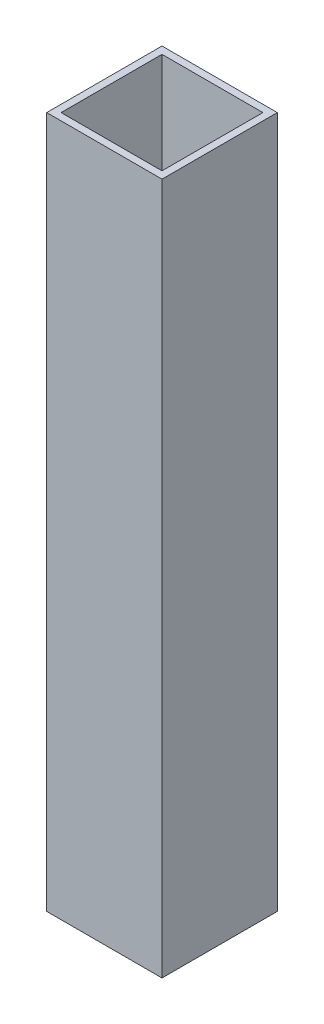
ISO-10303-21;
HEADER;
FILE_DESCRIPTION(('STEP AP214'),'2;1');
FILE_NAME('part.step','',(''),(''),'','','');
FILE_SCHEMA(('AUTOMOTIVE_DESIGN { 1 0 10303 214 1 1 1 1 }'));
ENDSEC;
DATA;
#1=APPLICATION_CONTEXT('core data for automotive mechanical design processes');
#2=APPLICATION_PROTOCOL_DEFINITION('international standard','automotive_design',2000,#1);
#3=PRODUCT_CONTEXT('',#1,'mechanical');
#4=PRODUCT('Part','Part','',(#3));
#5=PRODUCT_RELATED_PRODUCT_CATEGORY('part','',(#4));
#6=PRODUCT_DEFINITION_FORMATION('','',#4);
#7=PRODUCT_DEFINITION_CONTEXT('part definition',#1,'design');
#8=PRODUCT_DEFINITION('design','',#6,#7);
#9=PRODUCT_DEFINITION_SHAPE('','',#8);
#10=(LENGTH_UNIT() NAMED_UNIT(*) SI_UNIT(.MILLI.,.METRE.));
#11=(NAMED_UNIT(*) PLANE_ANGLE_UNIT() SI_UNIT($,.RADIAN.));
#12=(NAMED_UNIT(*) SI_UNIT($,.STERADIAN.) SOLID_ANGLE_UNIT());
#13=UNCERTAINTY_MEASURE_WITH_UNIT(LENGTH_MEASURE(1.E-05),#10,'distance_accuracy_value','');
#14=(GEOMETRIC_REPRESENTATION_CONTEXT(3) GLOBAL_UNCERTAINTY_ASSIGNED_CONTEXT((#13)) GLOBAL_UNIT_ASSIGNED_CONTEXT((#10,
#11,#12)) REPRESENTATION_CONTEXT('',''));
#15=CARTESIAN_POINT('',(0.,0.,0.));
#16=DIRECTION('',(0.,0.,1.));
#17=DIRECTION('',(1.,0.,0.));
#18=AXIS2_PLACEMENT_3D('',#15,#16,#17);
#19=CARTESIAN_POINT('',(0.,152.4,0.));
#20=DIRECTION('',(0.,1.,0.));
#21=DIRECTION('',(0.,0.,1.));
#22=AXIS2_PLACEMENT_3D('',#19,#20,#21);
#23=PLANE('',#22);
#24=DIRECTION('',(0.,0.,1.));
#25=VECTOR('',#24,1.);
#26=CARTESIAN_POINT('',(-12.7,152.4,12.7));
#27=LINE('',#26,#25);
#28=CARTESIAN_POINT('',(-12.7,152.4,-12.7));
#29=VERTEX_POINT('',#28);
#30=CARTESIAN_POINT('',(-12.7,152.4,12.7));
#31=VERTEX_POINT('',#30);
#32=EDGE_CURVE('E134',#29,#31,#27,.T.);
#33=ORIENTED_EDGE('',*,*,#32,.T.);
#34=DIRECTION('',(1.,0.,0.));
#35=VECTOR('',#34,1.);
#36=CARTESIAN_POINT('',(12.7,152.4,12.7));
#37=LINE('',#36,#35);
#38=CARTESIAN_POINT('',(12.7,152.4,12.7));
#39=VERTEX_POINT('',#38);
#40=EDGE_CURVE('E137',#31,#39,#37,.T.);
#41=ORIENTED_EDGE('',*,*,#40,.T.);
#42=DIRECTION('',(0.,0.,-1.));
#43=VECTOR('',#42,1.);
#44=CARTESIAN_POINT('',(12.7,152.4,12.7));
#45=LINE('',#44,#43);
#46=CARTESIAN_POINT('',(12.7,152.4,-12.7));
#47=VERTEX_POINT('',#46);
#48=EDGE_CURVE('E140',#39,#47,#45,.T.);
#49=ORIENTED_EDGE('',*,*,#48,.T.);
#50=DIRECTION('',(-1.,0.,0.));
#51=VECTOR('',#50,1.);
#52=CARTESIAN_POINT('',(12.7,152.4,-12.7));
#53=LINE('',#52,#51);
#54=EDGE_CURVE('E142',#47,#29,#53,.T.);
#55=ORIENTED_EDGE('',*,*,#54,.T.);
#56=EDGE_LOOP('',(#33,#41,#49,#55));
#57=FACE_BOUND('',#56,.T.);
#58=DIRECTION('',(1.,0.,0.));
#59=VECTOR('',#58,1.);
#60=CARTESIAN_POINT('',(11.1125,152.4,11.1125));
#61=LINE('',#60,#59);
#62=CARTESIAN_POINT('',(-11.1125,152.4,11.1125));
#63=VERTEX_POINT('',#62);
#64=CARTESIAN_POINT('',(11.1125,152.4,11.1125));
#65=VERTEX_POINT('',#64);
#66=EDGE_CURVE('E106',#63,#65,#61,.T.);
#67=ORIENTED_EDGE('',*,*,#66,.F.);
#68=DIRECTION('',(0.,0.,1.));
#69=VECTOR('',#68,1.);
#70=CARTESIAN_POINT('',(-11.1125,152.4,11.1125));
#71=LINE('',#70,#69);
#72=CARTESIAN_POINT('',(-11.1125,152.4,-11.1125));
#73=VERTEX_POINT('',#72);
#74=EDGE_CURVE('E98',#73,#63,#71,.T.);
#75=ORIENTED_EDGE('',*,*,#74,.F.);
#76=DIRECTION('',(-1.,0.,0.));
#77=VECTOR('',#76,1.);
#78=CARTESIAN_POINT('',(11.1125,152.4,-11.1125));
#79=LINE('',#78,#77);
#80=CARTESIAN_POINT('',(11.1125,152.4,-11.1125));
#81=VERTEX_POINT('',#80);
#82=EDGE_CURVE('E120',#81,#73,#79,.T.);
#83=ORIENTED_EDGE('',*,*,#82,.F.);
#84=DIRECTION('',(0.,0.,-1.));
#85=VECTOR('',#84,1.);
#86=CARTESIAN_POINT('',(11.1125,152.4,11.1125));
#87=LINE('',#86,#85);
#88=EDGE_CURVE('E118',#65,#81,#87,.T.);
#89=ORIENTED_EDGE('',*,*,#88,.F.);
#90=EDGE_LOOP('',(#67,#75,#83,#89));
#91=FACE_BOUND('',#90,.T.);
#92=ADVANCED_FACE('F33',(#57,#91),#23,.T.);
#93=CARTESIAN_POINT('',(0.,0.,0.));
#94=DIRECTION('',(0.,1.,0.));
#95=DIRECTION('',(0.,0.,1.));
#96=AXIS2_PLACEMENT_3D('',#93,#94,#95);
#97=PLANE('',#96);
#98=DIRECTION('',(0.,0.,1.));
#99=VECTOR('',#98,1.);
#100=CARTESIAN_POINT('',(-12.7,0.,12.7));
#101=LINE('',#100,#99);
#102=CARTESIAN_POINT('',(-12.7,0.,-12.7));
#103=VERTEX_POINT('',#102);
#104=CARTESIAN_POINT('',(-12.7,0.,12.7));
#105=VERTEX_POINT('',#104);
#106=EDGE_CURVE('E114',#103,#105,#101,.T.);
#107=ORIENTED_EDGE('',*,*,#106,.F.);
#108=DIRECTION('',(-1.,0.,0.));
#109=VECTOR('',#108,1.);
#110=CARTESIAN_POINT('',(12.7,0.,-12.7));
#111=LINE('',#110,#109);
#112=CARTESIAN_POINT('',(12.7,0.,-12.7));
#113=VERTEX_POINT('',#112);
#114=EDGE_CURVE('E138',#113,#103,#111,.T.);
#115=ORIENTED_EDGE('',*,*,#114,.F.);
#116=DIRECTION('',(0.,0.,-1.));
#117=VECTOR('',#116,1.);
#118=CARTESIAN_POINT('',(12.7,0.,12.7));
#119=LINE('',#118,#117);
#120=CARTESIAN_POINT('',(12.7,0.,12.7));
#121=VERTEX_POINT('',#120);
#122=EDGE_CURVE('E149',#121,#113,#119,.T.);
#123=ORIENTED_EDGE('',*,*,#122,.F.);
#124=DIRECTION('',(1.,0.,0.));
#125=VECTOR('',#124,1.);
#126=CARTESIAN_POINT('',(12.7,0.,12.7));
#127=LINE('',#126,#125);
#128=EDGE_CURVE('E147',#105,#121,#127,.T.);
#129=ORIENTED_EDGE('',*,*,#128,.F.);
#130=EDGE_LOOP('',(#107,#115,#123,#129));
#131=FACE_BOUND('',#130,.T.);
#132=DIRECTION('',(0.,0.,1.));
#133=VECTOR('',#132,1.);
#134=CARTESIAN_POINT('',(-11.1125,0.,11.1125));
#135=LINE('',#134,#133);
#136=CARTESIAN_POINT('',(-11.1125,0.,-11.1125));
#137=VERTEX_POINT('',#136);
#138=CARTESIAN_POINT('',(-11.1125,0.,11.1125));
#139=VERTEX_POINT('',#138);
#140=EDGE_CURVE('E56',#137,#139,#135,.T.);
#141=ORIENTED_EDGE('',*,*,#140,.T.);
#142=DIRECTION('',(1.,0.,0.));
#143=VECTOR('',#142,1.);
#144=CARTESIAN_POINT('',(11.1125,0.,11.1125));
#145=LINE('',#144,#143);
#146=CARTESIAN_POINT('',(11.1125,0.,11.1125));
#147=VERTEX_POINT('',#146);
#148=EDGE_CURVE('E113',#139,#147,#145,.T.);
#149=ORIENTED_EDGE('',*,*,#148,.T.);
#150=DIRECTION('',(0.,0.,-1.));
#151=VECTOR('',#150,1.);
#152=CARTESIAN_POINT('',(11.1125,0.,11.1125));
#153=LINE('',#152,#151);
#154=CARTESIAN_POINT('',(11.1125,0.,-11.1125));
#155=VERTEX_POINT('',#154);
#156=EDGE_CURVE('E126',#147,#155,#153,.T.);
#157=ORIENTED_EDGE('',*,*,#156,.T.);
#158=DIRECTION('',(-1.,0.,0.));
#159=VECTOR('',#158,1.);
#160=CARTESIAN_POINT('',(11.1125,0.,-11.1125));
#161=LINE('',#160,#159);
#162=EDGE_CURVE('E107',#155,#137,#161,.T.);
#163=ORIENTED_EDGE('',*,*,#162,.T.);
#164=EDGE_LOOP('',(#141,#149,#157,#163));
#165=FACE_BOUND('',#164,.T.);
#166=ADVANCED_FACE('F167',(#131,#165),#97,.F.);
#167=CARTESIAN_POINT('',(-12.7,152.4,12.7));
#168=DIRECTION('',(1.,0.,0.));
#169=DIRECTION('',(0.,0.,-1.));
#170=AXIS2_PLACEMENT_3D('',#167,#168,#169);
#171=PLANE('',#170);
#172=ORIENTED_EDGE('',*,*,#106,.T.);
#173=DIRECTION('',(0.,-1.,0.));
#174=VECTOR('',#173,1.);
#175=CARTESIAN_POINT('',(-12.7,152.4,12.7));
#176=LINE('',#175,#174);
#177=EDGE_CURVE('E11',#31,#105,#176,.T.);
#178=ORIENTED_EDGE('',*,*,#177,.F.);
#179=ORIENTED_EDGE('',*,*,#32,.F.);
#180=DIRECTION('',(0.,-1.,0.));
#181=VECTOR('',#180,1.);
#182=CARTESIAN_POINT('',(-12.7,152.4,-12.7));
#183=LINE('',#182,#181);
#184=EDGE_CURVE('E144',#29,#103,#183,.T.);
#185=ORIENTED_EDGE('',*,*,#184,.T.);
#186=EDGE_LOOP('',(#172,#178,#179,#185));
#187=FACE_BOUND('',#186,.T.);
#188=ADVANCED_FACE('F35',(#187),#171,.F.);
#189=CARTESIAN_POINT('',(12.7,152.4,12.7));
#190=DIRECTION('',(0.,0.,-1.));
#191=DIRECTION('',(-1.,0.,0.));
#192=AXIS2_PLACEMENT_3D('',#189,#190,#191);
#193=PLANE('',#192);
#194=ORIENTED_EDGE('',*,*,#128,.T.);
#195=DIRECTION('',(0.,-1.,0.));
#196=VECTOR('',#195,1.);
#197=CARTESIAN_POINT('',(12.7,152.4,12.7));
#198=LINE('',#197,#196);
#199=EDGE_CURVE('E41',#39,#121,#198,.T.);
#200=ORIENTED_EDGE('',*,*,#199,.F.);
#201=ORIENTED_EDGE('',*,*,#40,.F.);
#202=ORIENTED_EDGE('',*,*,#177,.T.);
#203=EDGE_LOOP('',(#194,#200,#201,#202));
#204=FACE_BOUND('',#203,.T.);
#205=ADVANCED_FACE('F177',(#204),#193,.F.);
#206=CARTESIAN_POINT('',(12.7,152.4,12.7));
#207=DIRECTION('',(-1.,0.,0.));
#208=DIRECTION('',(0.,0.,1.));
#209=AXIS2_PLACEMENT_3D('',#206,#207,#208);
#210=PLANE('',#209);
#211=ORIENTED_EDGE('',*,*,#122,.T.);
#212=DIRECTION('',(0.,-1.,0.));
#213=VECTOR('',#212,1.);
#214=CARTESIAN_POINT('',(12.7,152.4,-12.7));
#215=LINE('',#214,#213);
#216=EDGE_CURVE('E154',#47,#113,#215,.T.);
#217=ORIENTED_EDGE('',*,*,#216,.F.);
#218=ORIENTED_EDGE('',*,*,#48,.F.);
#219=ORIENTED_EDGE('',*,*,#199,.T.);
#220=EDGE_LOOP('',(#211,#217,#218,#219));
#221=FACE_BOUND('',#220,.T.);
#222=ADVANCED_FACE('F161',(#221),#210,.F.);
#223=CARTESIAN_POINT('',(12.7,152.4,-12.7));
#224=DIRECTION('',(0.,0.,1.));
#225=DIRECTION('',(1.,0.,0.));
#226=AXIS2_PLACEMENT_3D('',#223,#224,#225);
#227=PLANE('',#226);
#228=ORIENTED_EDGE('',*,*,#114,.T.);
#229=ORIENTED_EDGE('',*,*,#184,.F.);
#230=ORIENTED_EDGE('',*,*,#54,.F.);
#231=ORIENTED_EDGE('',*,*,#216,.T.);
#232=EDGE_LOOP('',(#228,#229,#230,#231));
#233=FACE_BOUND('',#232,.T.);
#234=ADVANCED_FACE('F171',(#233),#227,.F.);
#235=CARTESIAN_POINT('',(-11.1125,152.4,11.1125));
#236=DIRECTION('',(1.,0.,0.));
#237=DIRECTION('',(0.,0.,-1.));
#238=AXIS2_PLACEMENT_3D('',#235,#236,#237);
#239=PLANE('',#238);
#240=ORIENTED_EDGE('',*,*,#140,.F.);
#241=DIRECTION('',(0.,-1.,0.));
#242=VECTOR('',#241,1.);
#243=CARTESIAN_POINT('',(-11.1125,152.4,-11.1125));
#244=LINE('',#243,#242);
#245=EDGE_CURVE('E102',#73,#137,#244,.T.);
#246=ORIENTED_EDGE('',*,*,#245,.F.);
#247=ORIENTED_EDGE('',*,*,#74,.T.);
#248=DIRECTION('',(0.,-1.,0.));
#249=VECTOR('',#248,1.);
#250=CARTESIAN_POINT('',(-11.1125,152.4,11.1125));
#251=LINE('',#250,#249);
#252=EDGE_CURVE('E101',#63,#139,#251,.T.);
#253=ORIENTED_EDGE('',*,*,#252,.T.);
#254=EDGE_LOOP('',(#240,#246,#247,#253));
#255=FACE_BOUND('',#254,.T.);
#256=ADVANCED_FACE('F100',(#255),#239,.T.);
#257=CARTESIAN_POINT('',(11.1125,152.4,11.1125));
#258=DIRECTION('',(0.,0.,-1.));
#259=DIRECTION('',(-1.,0.,0.));
#260=AXIS2_PLACEMENT_3D('',#257,#258,#259);
#261=PLANE('',#260);
#262=ORIENTED_EDGE('',*,*,#148,.F.);
#263=ORIENTED_EDGE('',*,*,#252,.F.);
#264=ORIENTED_EDGE('',*,*,#66,.T.);
#265=DIRECTION('',(0.,-1.,0.));
#266=VECTOR('',#265,1.);
#267=CARTESIAN_POINT('',(11.1125,152.4,11.1125));
#268=LINE('',#267,#266);
#269=EDGE_CURVE('E115',#65,#147,#268,.T.);
#270=ORIENTED_EDGE('',*,*,#269,.T.);
#271=EDGE_LOOP('',(#262,#263,#264,#270));
#272=FACE_BOUND('',#271,.T.);
#273=ADVANCED_FACE('F110',(#272),#261,.T.);
#274=CARTESIAN_POINT('',(11.1125,152.4,11.1125));
#275=DIRECTION('',(-1.,0.,0.));
#276=DIRECTION('',(0.,0.,1.));
#277=AXIS2_PLACEMENT_3D('',#274,#275,#276);
#278=PLANE('',#277);
#279=ORIENTED_EDGE('',*,*,#156,.F.);
#280=ORIENTED_EDGE('',*,*,#269,.F.);
#281=ORIENTED_EDGE('',*,*,#88,.T.);
#282=DIRECTION('',(0.,-1.,0.));
#283=VECTOR('',#282,1.);
#284=CARTESIAN_POINT('',(11.1125,152.4,-11.1125));
#285=LINE('',#284,#283);
#286=EDGE_CURVE('E48',#81,#155,#285,.T.);
#287=ORIENTED_EDGE('',*,*,#286,.T.);
#288=EDGE_LOOP('',(#279,#280,#281,#287));
#289=FACE_BOUND('',#288,.T.);
#290=ADVANCED_FACE('F200',(#289),#278,.T.);
#291=CARTESIAN_POINT('',(11.1125,152.4,-11.1125));
#292=DIRECTION('',(0.,0.,1.));
#293=DIRECTION('',(1.,0.,0.));
#294=AXIS2_PLACEMENT_3D('',#291,#292,#293);
#295=PLANE('',#294);
#296=ORIENTED_EDGE('',*,*,#162,.F.);
#297=ORIENTED_EDGE('',*,*,#286,.F.);
#298=ORIENTED_EDGE('',*,*,#82,.T.);
#299=ORIENTED_EDGE('',*,*,#245,.T.);
#300=EDGE_LOOP('',(#296,#297,#298,#299));
#301=FACE_BOUND('',#300,.T.);
#302=ADVANCED_FACE('F204',(#301),#295,.T.);
#303=CLOSED_SHELL('',(#92,#166,#188,#205,#222,#234,#256,#273,#290,#302));
#304=MANIFOLD_SOLID_BREP('B2',#303);
#305=ADVANCED_BREP_SHAPE_REPRESENTATION('',(#18,#304),#14);
#306=SHAPE_DEFINITION_REPRESENTATION(#9,#305);
ENDSEC;
END-ISO-10303-21;
